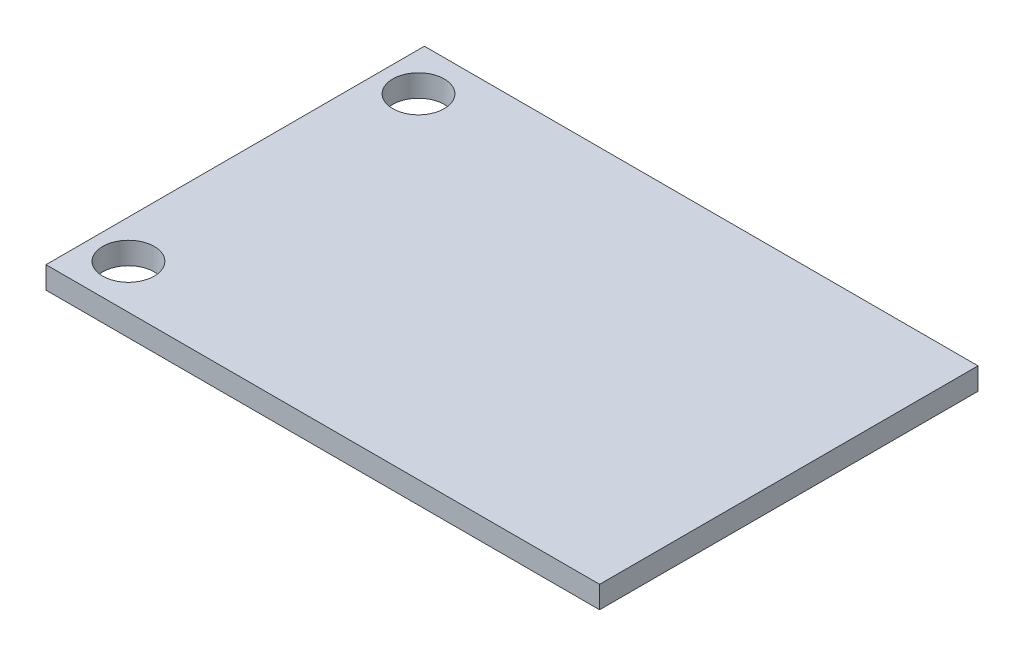
ISO-10303-21;
HEADER;
FILE_DESCRIPTION(('STEP AP214'),'2;1');
FILE_NAME('part.step','',(''),(''),'','','');
FILE_SCHEMA(('AUTOMOTIVE_DESIGN { 1 0 10303 214 1 1 1 1 }'));
ENDSEC;
DATA;
#1=APPLICATION_CONTEXT('core data for automotive mechanical design processes');
#2=APPLICATION_PROTOCOL_DEFINITION('international standard','automotive_design',2000,#1);
#3=PRODUCT_CONTEXT('',#1,'mechanical');
#4=PRODUCT('Part','Part','',(#3));
#5=PRODUCT_RELATED_PRODUCT_CATEGORY('part','',(#4));
#6=PRODUCT_DEFINITION_FORMATION('','',#4);
#7=PRODUCT_DEFINITION_CONTEXT('part definition',#1,'design');
#8=PRODUCT_DEFINITION('design','',#6,#7);
#9=PRODUCT_DEFINITION_SHAPE('','',#8);
#10=(LENGTH_UNIT() NAMED_UNIT(*) SI_UNIT(.MILLI.,.METRE.));
#11=(NAMED_UNIT(*) PLANE_ANGLE_UNIT() SI_UNIT($,.RADIAN.));
#12=(NAMED_UNIT(*) SI_UNIT($,.STERADIAN.) SOLID_ANGLE_UNIT());
#13=UNCERTAINTY_MEASURE_WITH_UNIT(LENGTH_MEASURE(1.E-05),#10,'distance_accuracy_value','');
#14=(GEOMETRIC_REPRESENTATION_CONTEXT(3) GLOBAL_UNCERTAINTY_ASSIGNED_CONTEXT((#13)) GLOBAL_UNIT_ASSIGNED_CONTEXT((#10,
#11,#12)) REPRESENTATION_CONTEXT('',''));
#15=CARTESIAN_POINT('',(0.,0.,0.));
#16=DIRECTION('',(0.,0.,1.));
#17=DIRECTION('',(1.,0.,0.));
#18=AXIS2_PLACEMENT_3D('',#15,#16,#17);
#19=CARTESIAN_POINT('',(0.,1.5,0.));
#20=DIRECTION('',(1.,0.,0.));
#21=DIRECTION('',(0.,0.,-1.));
#22=AXIS2_PLACEMENT_3D('',#19,#20,#21);
#23=PLANE('',#22);
#24=DIRECTION('',(0.,0.,1.));
#25=VECTOR('',#24,1.);
#26=CARTESIAN_POINT('',(0.,0.,0.));
#27=LINE('',#26,#25);
#28=CARTESIAN_POINT('',(0.,0.,0.));
#29=VERTEX_POINT('',#28);
#30=CARTESIAN_POINT('',(0.,0.,25.7));
#31=VERTEX_POINT('',#30);
#32=EDGE_CURVE('E96',#29,#31,#27,.T.);
#33=ORIENTED_EDGE('',*,*,#32,.T.);
#34=DIRECTION('',(0.,-1.,0.));
#35=VECTOR('',#34,1.);
#36=CARTESIAN_POINT('',(0.,1.5,25.7));
#37=LINE('',#36,#35);
#38=CARTESIAN_POINT('',(0.,1.5,25.7));
#39=VERTEX_POINT('',#38);
#40=EDGE_CURVE('E11',#39,#31,#37,.T.);
#41=ORIENTED_EDGE('',*,*,#40,.F.);
#42=DIRECTION('',(0.,0.,1.));
#43=VECTOR('',#42,1.);
#44=CARTESIAN_POINT('',(0.,1.5,0.));
#45=LINE('',#44,#43);
#46=CARTESIAN_POINT('',(0.,1.5,0.));
#47=VERTEX_POINT('',#46);
#48=EDGE_CURVE('E84',#47,#39,#45,.T.);
#49=ORIENTED_EDGE('',*,*,#48,.F.);
#50=DIRECTION('',(0.,-1.,0.));
#51=VECTOR('',#50,1.);
#52=CARTESIAN_POINT('',(0.,1.5,0.));
#53=LINE('',#52,#51);
#54=EDGE_CURVE('E92',#47,#29,#53,.T.);
#55=ORIENTED_EDGE('',*,*,#54,.T.);
#56=EDGE_LOOP('',(#33,#41,#49,#55));
#57=FACE_BOUND('',#56,.T.);
#58=ADVANCED_FACE('F33',(#57),#23,.F.);
#59=CARTESIAN_POINT('',(0.,1.5,25.7));
#60=DIRECTION('',(0.,0.,-1.));
#61=DIRECTION('',(-1.,0.,0.));
#62=AXIS2_PLACEMENT_3D('',#59,#60,#61);
#63=PLANE('',#62);
#64=DIRECTION('',(1.,0.,0.));
#65=VECTOR('',#64,1.);
#66=CARTESIAN_POINT('',(0.,0.,25.7));
#67=LINE('',#66,#65);
#68=CARTESIAN_POINT('',(37.6,0.,25.7));
#69=VERTEX_POINT('',#68);
#70=EDGE_CURVE('E88',#31,#69,#67,.T.);
#71=ORIENTED_EDGE('',*,*,#70,.T.);
#72=DIRECTION('',(0.,-1.,0.));
#73=VECTOR('',#72,1.);
#74=CARTESIAN_POINT('',(37.6,1.5,25.7));
#75=LINE('',#74,#73);
#76=CARTESIAN_POINT('',(37.6,1.5,25.7));
#77=VERTEX_POINT('',#76);
#78=EDGE_CURVE('E41',#77,#69,#75,.T.);
#79=ORIENTED_EDGE('',*,*,#78,.F.);
#80=DIRECTION('',(1.,0.,0.));
#81=VECTOR('',#80,1.);
#82=CARTESIAN_POINT('',(0.,1.5,25.7));
#83=LINE('',#82,#81);
#84=EDGE_CURVE('E79',#39,#77,#83,.T.);
#85=ORIENTED_EDGE('',*,*,#84,.F.);
#86=ORIENTED_EDGE('',*,*,#40,.T.);
#87=EDGE_LOOP('',(#71,#79,#85,#86));
#88=FACE_BOUND('',#87,.T.);
#89=ADVANCED_FACE('F87',(#88),#63,.F.);
#90=CARTESIAN_POINT('',(37.6,1.5,0.));
#91=DIRECTION('',(-1.,0.,0.));
#92=DIRECTION('',(0.,0.,1.));
#93=AXIS2_PLACEMENT_3D('',#90,#91,#92);
#94=PLANE('',#93);
#95=DIRECTION('',(0.,0.,-1.));
#96=VECTOR('',#95,1.);
#97=CARTESIAN_POINT('',(37.6,0.,0.));
#98=LINE('',#97,#96);
#99=CARTESIAN_POINT('',(37.6,0.,0.));
#100=VERTEX_POINT('',#99);
#101=EDGE_CURVE('E66',#69,#100,#98,.T.);
#102=ORIENTED_EDGE('',*,*,#101,.T.);
#103=DIRECTION('',(0.,-1.,0.));
#104=VECTOR('',#103,1.);
#105=CARTESIAN_POINT('',(37.6,1.5,0.));
#106=LINE('',#105,#104);
#107=CARTESIAN_POINT('',(37.6,1.5,0.));
#108=VERTEX_POINT('',#107);
#109=EDGE_CURVE('E89',#108,#100,#106,.T.);
#110=ORIENTED_EDGE('',*,*,#109,.F.);
#111=DIRECTION('',(0.,0.,-1.));
#112=VECTOR('',#111,1.);
#113=CARTESIAN_POINT('',(37.6,1.5,0.));
#114=LINE('',#113,#112);
#115=EDGE_CURVE('E82',#77,#108,#114,.T.);
#116=ORIENTED_EDGE('',*,*,#115,.F.);
#117=ORIENTED_EDGE('',*,*,#78,.T.);
#118=EDGE_LOOP('',(#102,#110,#116,#117));
#119=FACE_BOUND('',#118,.T.);
#120=ADVANCED_FACE('F90',(#119),#94,.F.);
#121=CARTESIAN_POINT('',(0.,1.5,0.));
#122=DIRECTION('',(0.,0.,1.));
#123=DIRECTION('',(1.,0.,0.));
#124=AXIS2_PLACEMENT_3D('',#121,#122,#123);
#125=PLANE('',#124);
#126=DIRECTION('',(-1.,0.,0.));
#127=VECTOR('',#126,1.);
#128=CARTESIAN_POINT('',(0.,0.,0.));
#129=LINE('',#128,#127);
#130=EDGE_CURVE('E72',#100,#29,#129,.T.);
#131=ORIENTED_EDGE('',*,*,#130,.T.);
#132=ORIENTED_EDGE('',*,*,#54,.F.);
#133=DIRECTION('',(-1.,0.,0.));
#134=VECTOR('',#133,1.);
#135=CARTESIAN_POINT('',(0.,1.5,0.));
#136=LINE('',#135,#134);
#137=EDGE_CURVE('E49',#108,#47,#136,.T.);
#138=ORIENTED_EDGE('',*,*,#137,.F.);
#139=ORIENTED_EDGE('',*,*,#109,.T.);
#140=EDGE_LOOP('',(#131,#132,#138,#139));
#141=FACE_BOUND('',#140,.T.);
#142=ADVANCED_FACE('F104',(#141),#125,.F.);
#143=CARTESIAN_POINT('',(0.,1.5,0.));
#144=DIRECTION('',(0.,1.,0.));
#145=DIRECTION('',(0.,0.,1.));
#146=AXIS2_PLACEMENT_3D('',#143,#144,#145);
#147=PLANE('',#146);
#148=CARTESIAN_POINT('',(2.6,1.5,3.));
#149=DIRECTION('',(0.,1.,0.));
#150=DIRECTION('',(0.,0.,1.));
#151=AXIS2_PLACEMENT_3D('',#148,#149,#150);
#152=CIRCLE('',#151,1.75);
#153=CARTESIAN_POINT('',(2.6,1.5,4.75));
#154=VERTEX_POINT('',#153);
#155=EDGE_CURVE('E116',#154,#154,#152,.T.);
#156=ORIENTED_EDGE('',*,*,#155,.F.);
#157=EDGE_LOOP('',(#156));
#158=FACE_BOUND('',#157,.T.);
#159=CARTESIAN_POINT('',(2.6,1.5,22.7));
#160=DIRECTION('',(0.,1.,0.));
#161=DIRECTION('',(0.,0.,1.));
#162=AXIS2_PLACEMENT_3D('',#159,#160,#161);
#163=CIRCLE('',#162,1.75);
#164=CARTESIAN_POINT('',(2.6,1.5,24.45));
#165=VERTEX_POINT('',#164);
#166=EDGE_CURVE('E110',#165,#165,#163,.T.);
#167=ORIENTED_EDGE('',*,*,#166,.F.);
#168=EDGE_LOOP('',(#167));
#169=FACE_BOUND('',#168,.T.);
#170=ORIENTED_EDGE('',*,*,#48,.T.);
#171=ORIENTED_EDGE('',*,*,#84,.T.);
#172=ORIENTED_EDGE('',*,*,#115,.T.);
#173=ORIENTED_EDGE('',*,*,#137,.T.);
#174=EDGE_LOOP('',(#170,#171,#172,#173));
#175=FACE_BOUND('',#174,.T.);
#176=ADVANCED_FACE('F80',(#158,#169,#175),#147,.T.);
#177=CARTESIAN_POINT('',(0.,0.,0.));
#178=DIRECTION('',(0.,1.,0.));
#179=DIRECTION('',(0.,0.,1.));
#180=AXIS2_PLACEMENT_3D('',#177,#178,#179);
#181=PLANE('',#180);
#182=CARTESIAN_POINT('',(2.6,0.,3.));
#183=DIRECTION('',(0.,1.,0.));
#184=DIRECTION('',(0.,0.,1.));
#185=AXIS2_PLACEMENT_3D('',#182,#183,#184);
#186=CIRCLE('',#185,1.75);
#187=CARTESIAN_POINT('',(2.6,0.,4.75));
#188=VERTEX_POINT('',#187);
#189=EDGE_CURVE('E99',#188,#188,#186,.T.);
#190=ORIENTED_EDGE('',*,*,#189,.T.);
#191=EDGE_LOOP('',(#190));
#192=FACE_BOUND('',#191,.T.);
#193=CARTESIAN_POINT('',(2.6,0.,22.7));
#194=DIRECTION('',(0.,1.,0.));
#195=DIRECTION('',(0.,0.,1.));
#196=AXIS2_PLACEMENT_3D('',#193,#194,#195);
#197=CIRCLE('',#196,1.75);
#198=CARTESIAN_POINT('',(2.6,0.,24.45));
#199=VERTEX_POINT('',#198);
#200=EDGE_CURVE('E113',#199,#199,#197,.T.);
#201=ORIENTED_EDGE('',*,*,#200,.T.);
#202=EDGE_LOOP('',(#201));
#203=FACE_BOUND('',#202,.T.);
#204=ORIENTED_EDGE('',*,*,#32,.F.);
#205=ORIENTED_EDGE('',*,*,#130,.F.);
#206=ORIENTED_EDGE('',*,*,#101,.F.);
#207=ORIENTED_EDGE('',*,*,#70,.F.);
#208=EDGE_LOOP('',(#204,#205,#206,#207));
#209=FACE_BOUND('',#208,.T.);
#210=ADVANCED_FACE('F107',(#192,#203,#209),#181,.F.);
#211=CARTESIAN_POINT('',(2.6,0.,22.7));
#212=DIRECTION('',(0.,1.,0.));
#213=DIRECTION('',(0.,0.,1.));
#214=AXIS2_PLACEMENT_3D('',#211,#212,#213);
#215=CYLINDRICAL_SURFACE('',#214,1.75);
#216=ORIENTED_EDGE('',*,*,#200,.F.);
#217=EDGE_LOOP('',(#216));
#218=FACE_BOUND('',#217,.T.);
#219=ORIENTED_EDGE('',*,*,#166,.T.);
#220=EDGE_LOOP('',(#219));
#221=FACE_BOUND('',#220,.T.);
#222=ADVANCED_FACE('F127',(#218,#221),#215,.F.);
#223=CARTESIAN_POINT('',(2.6,0.,3.));
#224=DIRECTION('',(0.,1.,0.));
#225=DIRECTION('',(0.,0.,1.));
#226=AXIS2_PLACEMENT_3D('',#223,#224,#225);
#227=CYLINDRICAL_SURFACE('',#226,1.75);
#228=ORIENTED_EDGE('',*,*,#189,.F.);
#229=EDGE_LOOP('',(#228));
#230=FACE_BOUND('',#229,.T.);
#231=ORIENTED_EDGE('',*,*,#155,.T.);
#232=EDGE_LOOP('',(#231));
#233=FACE_BOUND('',#232,.T.);
#234=ADVANCED_FACE('F124',(#230,#233),#227,.F.);
#235=CLOSED_SHELL('',(#58,#89,#120,#142,#176,#210,#222,#234));
#236=MANIFOLD_SOLID_BREP('B2',#235);
#237=ADVANCED_BREP_SHAPE_REPRESENTATION('',(#18,#236),#14);
#238=SHAPE_DEFINITION_REPRESENTATION(#9,#237);
ENDSEC;
END-ISO-10303-21;
